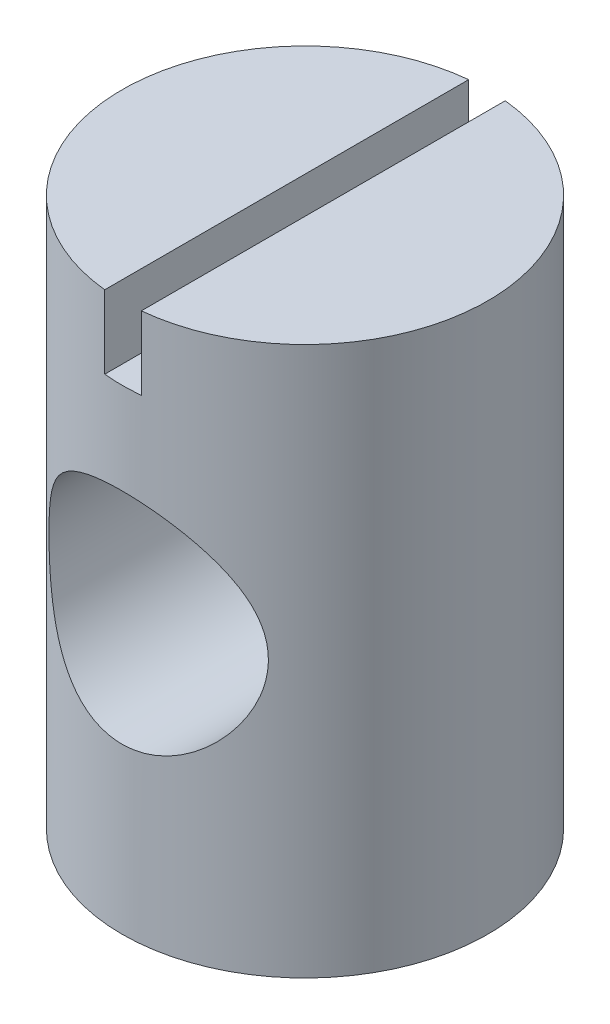
ISO-10303-21;
HEADER;
FILE_DESCRIPTION(('STEP AP214'),'2;1');
FILE_NAME('part.step','',(''),(''),'','','');
FILE_SCHEMA(('AUTOMOTIVE_DESIGN { 1 0 10303 214 1 1 1 1 }'));
ENDSEC;
DATA;
#1=APPLICATION_CONTEXT('core data for automotive mechanical design processes');
#2=APPLICATION_PROTOCOL_DEFINITION('international standard','automotive_design',2000,#1);
#3=PRODUCT_CONTEXT('',#1,'mechanical');
#4=PRODUCT('Part','Part','',(#3));
#5=PRODUCT_RELATED_PRODUCT_CATEGORY('part','',(#4));
#6=PRODUCT_DEFINITION_FORMATION('','',#4);
#7=PRODUCT_DEFINITION_CONTEXT('part definition',#1,'design');
#8=PRODUCT_DEFINITION('design','',#6,#7);
#9=PRODUCT_DEFINITION_SHAPE('','',#8);
#10=(LENGTH_UNIT() NAMED_UNIT(*) SI_UNIT(.MILLI.,.METRE.));
#11=(NAMED_UNIT(*) PLANE_ANGLE_UNIT() SI_UNIT($,.RADIAN.));
#12=(NAMED_UNIT(*) SI_UNIT($,.STERADIAN.) SOLID_ANGLE_UNIT());
#13=UNCERTAINTY_MEASURE_WITH_UNIT(LENGTH_MEASURE(1.E-05),#10,'distance_accuracy_value','');
#14=(GEOMETRIC_REPRESENTATION_CONTEXT(3) GLOBAL_UNCERTAINTY_ASSIGNED_CONTEXT((#13)) GLOBAL_UNIT_ASSIGNED_CONTEXT((#10,
#11,#12)) REPRESENTATION_CONTEXT('',''));
#15=CARTESIAN_POINT('',(0.,0.,0.));
#16=DIRECTION('',(0.,0.,1.));
#17=DIRECTION('',(1.,0.,0.));
#18=AXIS2_PLACEMENT_3D('',#15,#16,#17);
#19=CARTESIAN_POINT('',(0.,15.,0.));
#20=DIRECTION('',(0.,-1.,0.));
#21=DIRECTION('',(0.,0.,-1.));
#22=AXIS2_PLACEMENT_3D('',#19,#20,#21);
#23=CYLINDRICAL_SURFACE('',#22,5.);
#24=CARTESIAN_POINT('',(0.,15.,0.));
#25=DIRECTION('',(0.,1.,0.));
#26=DIRECTION('',(0.,0.,1.));
#27=AXIS2_PLACEMENT_3D('',#24,#25,#26);
#28=CIRCLE('',#27,5.);
#29=CARTESIAN_POINT('',(-0.500000000000001,15.,-4.9749371855331));
#30=VERTEX_POINT('',#29);
#31=CARTESIAN_POINT('',(-0.499999999999999,15.,4.9749371855331));
#32=VERTEX_POINT('',#31);
#33=EDGE_CURVE('E98',#30,#32,#28,.T.);
#34=ORIENTED_EDGE('',*,*,#33,.F.);
#35=DIRECTION('',(0.,-1.,0.));
#36=VECTOR('',#35,1.);
#37=CARTESIAN_POINT('',(-0.500000000000001,15.,-4.9749371855331));
#38=LINE('',#37,#36);
#39=CARTESIAN_POINT('',(-0.500000000000001,13.,-4.9749371855331));
#40=VERTEX_POINT('',#39);
#41=EDGE_CURVE('E104',#30,#40,#38,.T.);
#42=ORIENTED_EDGE('',*,*,#41,.T.);
#43=CARTESIAN_POINT('',(0.,13.,0.));
#44=DIRECTION('',(0.,1.,0.));
#45=DIRECTION('',(0.,0.,1.));
#46=AXIS2_PLACEMENT_3D('',#43,#44,#45);
#47=CIRCLE('',#46,5.);
#48=CARTESIAN_POINT('',(0.499999999999999,13.,-4.9749371855331));
#49=VERTEX_POINT('',#48);
#50=EDGE_CURVE('E94',#49,#40,#47,.T.);
#51=ORIENTED_EDGE('',*,*,#50,.F.);
#52=DIRECTION('',(0.,-1.,0.));
#53=VECTOR('',#52,1.);
#54=CARTESIAN_POINT('',(0.499999999999999,15.,-4.9749371855331));
#55=LINE('',#54,#53);
#56=CARTESIAN_POINT('',(0.499999999999999,15.,-4.9749371855331));
#57=VERTEX_POINT('',#56);
#58=EDGE_CURVE('E82',#49,#57,#55,.F.);
#59=ORIENTED_EDGE('',*,*,#58,.T.);
#60=CARTESIAN_POINT('',(0.500000000000001,15.,4.9749371855331));
#61=VERTEX_POINT('',#60);
#62=EDGE_CURVE('E88',#61,#57,#28,.T.);
#63=ORIENTED_EDGE('',*,*,#62,.F.);
#64=DIRECTION('',(0.,-1.,0.));
#65=VECTOR('',#64,1.);
#66=CARTESIAN_POINT('',(0.500000000000001,15.,4.9749371855331));
#67=LINE('',#66,#65);
#68=CARTESIAN_POINT('',(0.500000000000001,13.,4.9749371855331));
#69=VERTEX_POINT('',#68);
#70=EDGE_CURVE('E53',#61,#69,#67,.T.);
#71=ORIENTED_EDGE('',*,*,#70,.T.);
#72=CARTESIAN_POINT('',(-0.499999999999999,13.,4.9749371855331));
#73=VERTEX_POINT('',#72);
#74=EDGE_CURVE('E109',#73,#69,#47,.T.);
#75=ORIENTED_EDGE('',*,*,#74,.F.);
#76=DIRECTION('',(0.,-1.,0.));
#77=VECTOR('',#76,1.);
#78=CARTESIAN_POINT('',(-0.499999999999999,15.,4.9749371855331));
#79=LINE('',#78,#77);
#80=EDGE_CURVE('E61',#73,#32,#79,.F.);
#81=ORIENTED_EDGE('',*,*,#80,.T.);
#82=EDGE_LOOP('',(#34,#42,#51,#59,#63,#71,#75,#81));
#83=FACE_BOUND('',#82,.T.);
#84=CARTESIAN_POINT('',(0.,0.,0.));
#85=DIRECTION('',(0.,1.,0.));
#86=DIRECTION('',(0.,0.,1.));
#87=AXIS2_PLACEMENT_3D('',#84,#85,#86);
#88=CIRCLE('',#87,5.);
#89=CARTESIAN_POINT('',(0.,0.,5.));
#90=VERTEX_POINT('',#89);
#91=EDGE_CURVE('E101',#90,#90,#88,.T.);
#92=ORIENTED_EDGE('',*,*,#91,.T.);
#93=EDGE_LOOP('',(#92));
#94=FACE_BOUND('',#93,.T.);
#95=CARTESIAN_POINT('',(0.,10.5,-5.));
#96=CARTESIAN_POINT('',(0.0767697294351705,10.4999989437555,-4.99999907546385));
#97=CARTESIAN_POINT('',(0.153562134518387,10.4970464064299,-4.99822567812271));
#98=CARTESIAN_POINT('',(0.306548487758715,10.4852857670203,-4.99118362570631));
#99=CARTESIAN_POINT('',(0.382742059346593,10.4764742388118,-4.98591292553957));
#100=CARTESIAN_POINT('',(0.609808130024627,10.4413514405369,-4.96499345352549));
#101=CARTESIAN_POINT('',(0.758981863291667,10.4063522975666,-4.94423772571335));
#102=CARTESIAN_POINT('',(1.04754167363585,10.3152272564959,-4.89123238995897));
#103=CARTESIAN_POINT('',(1.18697226741342,10.2592060779873,-4.8590397955111));
#104=CARTESIAN_POINT('',(1.45405042800218,10.128279339403,-4.7859070225578));
#105=CARTESIAN_POINT('',(1.58170090938261,10.0533784676398,-4.74496901614699));
#106=CARTESIAN_POINT('',(1.83260160381823,9.88045034488488,-4.65410731283371));
#107=CARTESIAN_POINT('',(1.95476885986166,9.78109260883346,-4.60373587041895));
#108=CARTESIAN_POINT('',(2.1817645874806,9.56506559280781,-4.50060875905921));
#109=CARTESIAN_POINT('',(2.28657046750403,9.44837412578165,-4.4478500955754));
#110=CARTESIAN_POINT('',(2.48890019509837,9.18415297883109,-4.33822134833335));
#111=CARTESIAN_POINT('',(2.5839553962784,9.03459645787782,-4.28164035635797));
#112=CARTESIAN_POINT('',(2.74722868670786,8.71830685367312,-4.17876602596121));
#113=CARTESIAN_POINT('',(2.8154903315581,8.55160220796684,-4.13245604474886));
#114=CARTESIAN_POINT('',(2.90881204577224,8.2468070983431,-4.06709259377223));
#115=CARTESIAN_POINT('',(2.94032394587637,8.11152800163861,-4.04415766338645));
#116=CARTESIAN_POINT('',(2.98432344587083,7.83639256947861,-4.01180616527621));
#117=CARTESIAN_POINT('',(2.99683469884359,7.69654214669596,-4.00237279089368));
#118=CARTESIAN_POINT('',(3.0021101681982,7.41597700735214,-3.99841845126251));
#119=CARTESIAN_POINT('',(2.99483563630785,7.27526113408813,-4.00392674756739));
#120=CARTESIAN_POINT('',(2.96092124146105,6.99744246488214,-4.02906522155629));
#121=CARTESIAN_POINT('',(2.93426681225442,6.86034246705851,-4.04870602134773));
#122=CARTESIAN_POINT('',(2.86347831933193,6.59493945774946,-4.09906376582929));
#123=CARTESIAN_POINT('',(2.8195745342289,6.46654567700555,-4.12963433300037));
#124=CARTESIAN_POINT('',(2.71590167467071,6.2186102333682,-4.19854092703026));
#125=CARTESIAN_POINT('',(2.6561267841416,6.09907183617098,-4.2368797994146));
#126=CARTESIAN_POINT('',(2.51035773820671,5.85003086234366,-4.32510698365561));
#127=CARTESIAN_POINT('',(2.42160671901868,5.72244000763227,-4.3758426358075));
#128=CARTESIAN_POINT('',(2.22582963207776,5.48265084277988,-4.4786102252415));
#129=CARTESIAN_POINT('',(2.11878609335504,5.37046743459787,-4.53064336077653));
#130=CARTESIAN_POINT('',(1.87159040921357,5.14875774055151,-4.63871766962913));
#131=CARTESIAN_POINT('',(1.72890315178769,5.04178060876265,-4.69430681953073));
#132=CARTESIAN_POINT('',(1.50061053630278,4.90073128727714,-4.77018325995047));
#133=CARTESIAN_POINT('',(1.42209821815681,4.8569358644839,-4.79423315237467));
#134=CARTESIAN_POINT('',(1.26074368673913,4.776281176389,-4.83916496756429));
#135=CARTESIAN_POINT('',(1.17790417501176,4.73941764797919,-4.86004883588963));
#136=CARTESIAN_POINT('',(1.01376371174001,4.67518855714336,-4.8968267274493));
#137=CARTESIAN_POINT('',(0.932690066663957,4.64737343955079,-4.91295100454953));
#138=CARTESIAN_POINT('',(0.767879949732826,4.59866604415477,-4.94139126794745));
#139=CARTESIAN_POINT('',(0.684144997174637,4.57776989155364,-4.95370938553284));
#140=CARTESIAN_POINT('',(0.514744462654424,4.54322814527524,-4.97416370514887));
#141=CARTESIAN_POINT('',(0.42908034196961,4.52957724417139,-4.98230296820872));
#142=CARTESIAN_POINT('',(0.256621746592207,4.5097338156098,-4.99415996414414));
#143=CARTESIAN_POINT('',(0.169827432617759,4.50354023914868,-4.99787831889699));
#144=CARTESIAN_POINT('',(-0.0673242571106429,4.49700732971637,-5.00179157954795));
#145=CARTESIAN_POINT('',(-0.218056842610661,4.5041884543694,-4.99746512571837));
#146=CARTESIAN_POINT('',(-0.515686907628997,4.5408455417291,-4.97557955020067));
#147=CARTESIAN_POINT('',(-0.662584464852966,4.57032105234186,-4.95802069684413));
#148=CARTESIAN_POINT('',(-0.945142599254813,4.64908845918428,-4.91189447655688));
#149=CARTESIAN_POINT('',(-1.08098954856944,4.69788112659201,-4.88360514429733));
#150=CARTESIAN_POINT('',(-1.34253345184752,4.81335432420091,-4.81827798628348));
#151=CARTESIAN_POINT('',(-1.46822839746276,4.88003838259407,-4.78123843515362));
#152=CARTESIAN_POINT('',(-1.7200119213015,5.03711409097797,-4.69690981059277));
#153=CARTESIAN_POINT('',(-1.84478813824221,5.12924769383748,-4.6489560240695));
#154=CARTESIAN_POINT('',(-2.07805222548222,5.33078275125476,-4.54948534225871));
#155=CARTESIAN_POINT('',(-2.18652085154156,5.44020429960271,-4.49796434043363));
#156=CARTESIAN_POINT('',(-2.39863988264158,5.68982079149316,-4.38890846835682));
#157=CARTESIAN_POINT('',(-2.49982037884172,5.83216777394304,-4.33146483230154));
#158=CARTESIAN_POINT('',(-2.67690479207535,6.13443204612756,-4.22432364395571));
#159=CARTESIAN_POINT('',(-2.75283533845462,6.29433058715125,-4.1746179606141));
#160=CARTESIAN_POINT('',(-2.86285157351706,6.59248604511072,-4.09969818429266));
#161=CARTESIAN_POINT('',(-2.90243250662613,6.72796062464204,-4.07151318633887));
#162=CARTESIAN_POINT('',(-2.96227327821697,7.00506415623523,-4.02819211510624));
#163=CARTESIAN_POINT('',(-2.98255990395067,7.14668428945152,-4.01303795327895));
#164=CARTESIAN_POINT('',(-3.00268261034206,7.43275389439522,-3.99800893189922));
#165=CARTESIAN_POINT('',(-3.00244179030845,7.5772119782483,-3.99819152744816));
#166=CARTESIAN_POINT('',(-2.98132945103105,7.8637888743464,-4.01395435932838));
#167=CARTESIAN_POINT('',(-2.96044671369591,8.00590637187481,-4.02954296823692));
#168=CARTESIAN_POINT('',(-2.90080351212233,8.2769768239951,-4.07266369966216));
#169=CARTESIAN_POINT('',(-2.86295284328648,8.40623414792436,-4.09958421715569));
#170=CARTESIAN_POINT('',(-2.77126473512031,8.65667454965315,-4.16211005816609));
#171=CARTESIAN_POINT('',(-2.7174212751772,8.77785456561299,-4.19771865147484));
#172=CARTESIAN_POINT('',(-2.58578536859698,9.02863953945999,-4.28025972950371));
#173=CARTESIAN_POINT('',(-2.50558518231556,9.15668150821477,-4.32809142579694));
#174=CARTESIAN_POINT('',(-2.32751213746957,9.3987608453066,-4.42640286674054));
#175=CARTESIAN_POINT('',(-2.22962472612067,9.51278655047955,-4.47688476749087));
#176=CARTESIAN_POINT('',(-2.00020353552556,9.74269884332947,-4.5845123827036));
#177=CARTESIAN_POINT('',(-1.86578571790514,9.85584987986161,-4.64140045738634));
#178=CARTESIAN_POINT('',(-1.57689277813436,10.0582079860481,-4.74731429537958));
#179=CARTESIAN_POINT('',(-1.42241049573675,10.1474064729197,-4.79633723789531));
#180=CARTESIAN_POINT('',(-1.18102189661685,10.2591244741905,-4.85920558314903));
#181=CARTESIAN_POINT('',(-1.10025014285135,10.2923359959645,-4.87817139185349));
#182=CARTESIAN_POINT('',(-0.935442217988385,10.3517721381435,-4.91243413775203));
#183=CARTESIAN_POINT('',(-0.851407984788098,10.3780008357009,-4.9277332153652));
#184=CARTESIAN_POINT('',(-0.681001816074563,10.4230094420757,-4.95415527987996));
#185=CARTESIAN_POINT('',(-0.59463750060929,10.4418110773033,-4.9652904423195));
#186=CARTESIAN_POINT('',(-0.42018374602076,10.471744355323,-4.98308318645253));
#187=CARTESIAN_POINT('',(-0.332095806784394,10.4828823861533,-4.98974449723791));
#188=CARTESIAN_POINT('',(-0.203123929661335,10.4933916838053,-4.99603728421477));
#189=CARTESIAN_POINT('',(-0.162556281113486,10.495868430454,-4.99752198179196));
#190=CARTESIAN_POINT('',(-0.0813278781867663,10.4991728969139,-4.99950360169341));
#191=CARTESIAN_POINT('',(-0.0406671206271711,10.5000005595229,-5.00000048975323));
#192=CARTESIAN_POINT('',(0.,10.5,-5.));
#193=B_SPLINE_CURVE_WITH_KNOTS('',3,(#95,#96,#97,#98,#99,#100,#101,#102,#103,#104,#105,#106,
#107,#108,#109,#110,#111,#112,#113,#114,#115,#116,#117,#118,#119,#120,#121,#122,#123,#124,#125,
#126,#127,#128,#129,#130,#131,#132,#133,#134,#135,#136,#137,#138,#139,#140,#141,#142,#143,#144,
#145,#146,#147,#148,#149,#150,#151,#152,#153,#154,#155,#156,#157,#158,#159,#160,#161,#162,#163,
#164,#165,#166,#167,#168,#169,#170,#171,#172,#173,#174,#175,#176,#177,#178,#179,#180,#181,#182,
#183,#184,#185,#186,#187,#188,#189,#190,#191,#192),.UNSPECIFIED.,.T.,.F.,(4,2,2,2,2,2,2,2,2,2,2,
2,2,2,2,2,2,2,2,2,2,2,2,2,2,2,2,2,2,2,2,2,2,2,2,2,2,2,2,2,2,2,2,2,2,2,2,2,4),(0.,
0.230263300595003,0.4606613693334,0.922002149276126,1.38107466343613,1.84003329022065,
2.33408870888555,2.82878205293211,3.38413315803225,3.93857770807794,4.35913349134877,
4.77916531256766,5.20002031165062,5.62119195971355,6.03692224610024,6.45280509043347,
6.94139679873935,7.43045779030958,7.98767605192992,8.26653157143431,8.54521503013734,
8.80648473589063,9.06760787545943,9.3285394673096,9.58943435026958,10.0398406663534,
10.490237849174,10.9296843257003,11.3692175250854,11.8543559282721,12.3400624135416,
12.889063860465,13.437484464234,13.8674843581987,14.2968863865712,14.7278971274535,
15.1591422350194,15.5696105785277,15.9802336423656,16.4539008129506,16.927959499309,
17.4794148474152,18.0310675325446,18.2988384573895,18.5664526907294,18.8332781687618,
19.0998809626714,19.221853785686,19.3438308395353),.UNSPECIFIED.);
#194=CARTESIAN_POINT('',(0.,10.5,-5.));
#195=VERTEX_POINT('',#194);
#196=EDGE_CURVE('E46',#195,#195,#193,.T.);
#197=ORIENTED_EDGE('',*,*,#196,.F.);
#198=EDGE_LOOP('',(#197));
#199=FACE_BOUND('',#198,.T.);
#200=CARTESIAN_POINT('',(0.,4.5,5.));
#201=CARTESIAN_POINT('',(0.0767697294351705,4.50000105624454,4.99999907546385));
#202=CARTESIAN_POINT('',(0.153562134518387,4.50295359357007,4.99822567812271));
#203=CARTESIAN_POINT('',(0.306548487758715,4.51471423297974,4.99118362570631));
#204=CARTESIAN_POINT('',(0.382742059346592,4.52352576118823,4.98591292553957));
#205=CARTESIAN_POINT('',(0.609808130024627,4.55864855946313,4.96499345352549));
#206=CARTESIAN_POINT('',(0.758981863291667,4.59364770243344,4.94423772571335));
#207=CARTESIAN_POINT('',(1.04754167363585,4.68477274350412,4.89123238995897));
#208=CARTESIAN_POINT('',(1.18697226741342,4.74079392201274,4.8590397955111));
#209=CARTESIAN_POINT('',(1.45405042800218,4.87172066059704,4.7859070225578));
#210=CARTESIAN_POINT('',(1.58170090938261,4.94662153236016,4.74496901614699));
#211=CARTESIAN_POINT('',(1.83260160381823,5.11954965511512,4.65410731283371));
#212=CARTESIAN_POINT('',(1.95476885986166,5.21890739116654,4.60373587041895));
#213=CARTESIAN_POINT('',(2.1817645874806,5.43493440719218,4.50060875905921));
#214=CARTESIAN_POINT('',(2.28657046750404,5.55162587421835,4.4478500955754));
#215=CARTESIAN_POINT('',(2.48890019509838,5.81584702116891,4.33822134833335));
#216=CARTESIAN_POINT('',(2.5839553962784,5.96540354212218,4.28164035635797));
#217=CARTESIAN_POINT('',(2.74722868670786,6.28169314632688,4.17876602596121));
#218=CARTESIAN_POINT('',(2.8154903315581,6.44839779203316,4.13245604474886));
#219=CARTESIAN_POINT('',(2.90881204577224,6.7531929016569,4.06709259377223));
#220=CARTESIAN_POINT('',(2.94032394587637,6.88847199836139,4.04415766338645));
#221=CARTESIAN_POINT('',(2.98432344587083,7.16360743052139,4.01180616527621));
#222=CARTESIAN_POINT('',(2.99683469884359,7.30345785330403,4.00237279089368));
#223=CARTESIAN_POINT('',(3.0021101681982,7.58402299264786,3.99841845126251));
#224=CARTESIAN_POINT('',(2.99483563630785,7.72473886591187,4.00392674756739));
#225=CARTESIAN_POINT('',(2.96092124146105,8.00255753511786,4.02906522155629));
#226=CARTESIAN_POINT('',(2.93426681225442,8.13965753294149,4.04870602134773));
#227=CARTESIAN_POINT('',(2.86347831933193,8.40506054225054,4.09906376582928));
#228=CARTESIAN_POINT('',(2.8195745342289,8.53345432299445,4.12963433300037));
#229=CARTESIAN_POINT('',(2.71590167467071,8.7813897666318,4.19854092703026));
#230=CARTESIAN_POINT('',(2.6561267841416,8.90092816382902,4.23687979941459));
#231=CARTESIAN_POINT('',(2.51035773820671,9.14996913765634,4.32510698365561));
#232=CARTESIAN_POINT('',(2.42160671901868,9.27755999236773,4.3758426358075));
#233=CARTESIAN_POINT('',(2.22582963207776,9.51734915722011,4.4786102252415));
#234=CARTESIAN_POINT('',(2.11878609335504,9.62953256540212,4.53064336077653));
#235=CARTESIAN_POINT('',(1.87159040921357,9.85124225944849,4.63871766962913));
#236=CARTESIAN_POINT('',(1.72890315178769,9.95821939123735,4.69430681953073));
#237=CARTESIAN_POINT('',(1.50061053630278,10.0992687127229,4.77018325995047));
#238=CARTESIAN_POINT('',(1.42209821815681,10.1430641355161,4.79423315237467));
#239=CARTESIAN_POINT('',(1.26074368673913,10.223718823611,4.83916496756429));
#240=CARTESIAN_POINT('',(1.17790417501176,10.2605823520208,4.86004883588963));
#241=CARTESIAN_POINT('',(1.01376371174001,10.3248114428566,4.8968267274493));
#242=CARTESIAN_POINT('',(0.932690066663961,10.3526265604492,4.91295100454953));
#243=CARTESIAN_POINT('',(0.76787994973283,10.4013339558452,4.94139126794745));
#244=CARTESIAN_POINT('',(0.68414499717464,10.4222301084464,4.95370938553284));
#245=CARTESIAN_POINT('',(0.514744462654426,10.4567718547248,4.97416370514887));
#246=CARTESIAN_POINT('',(0.429080341969612,10.4704227558286,4.98230296820872));
#247=CARTESIAN_POINT('',(0.256621746592208,10.4902661843902,4.99415996414414));
#248=CARTESIAN_POINT('',(0.169827432617761,10.4964597608513,4.99787831889699));
#249=CARTESIAN_POINT('',(-0.0673242571106405,10.5029926702836,5.00179157954795));
#250=CARTESIAN_POINT('',(-0.218056842610659,10.4958115456306,4.99746512571837));
#251=CARTESIAN_POINT('',(-0.515686907628994,10.4591544582709,4.97557955020067));
#252=CARTESIAN_POINT('',(-0.662584464852964,10.4296789476581,4.95802069684413));
#253=CARTESIAN_POINT('',(-0.945142599254811,10.3509115408157,4.91189447655688));
#254=CARTESIAN_POINT('',(-1.08098954856944,10.302118873408,4.88360514429733));
#255=CARTESIAN_POINT('',(-1.34253345184752,10.1866456757991,4.81827798628348));
#256=CARTESIAN_POINT('',(-1.46822839746276,10.1199616174059,4.78123843515362));
#257=CARTESIAN_POINT('',(-1.7200119213015,9.96288590902203,4.69690981059278));
#258=CARTESIAN_POINT('',(-1.84478813824221,9.87075230616252,4.6489560240695));
#259=CARTESIAN_POINT('',(-2.07805222548222,9.66921724874524,4.54948534225871));
#260=CARTESIAN_POINT('',(-2.18652085154156,9.55979570039729,4.49796434043363));
#261=CARTESIAN_POINT('',(-2.39863988264158,9.31017920850685,4.38890846835682));
#262=CARTESIAN_POINT('',(-2.49982037884172,9.16783222605696,4.33146483230154));
#263=CARTESIAN_POINT('',(-2.67690479207535,8.86556795387244,4.22432364395571));
#264=CARTESIAN_POINT('',(-2.75283533845462,8.70566941284875,4.1746179606141));
#265=CARTESIAN_POINT('',(-2.86285157351706,8.40751395488928,4.09969818429266));
#266=CARTESIAN_POINT('',(-2.90243250662613,8.27203937535796,4.07151318633887));
#267=CARTESIAN_POINT('',(-2.96227327821697,7.99493584376477,4.02819211510624));
#268=CARTESIAN_POINT('',(-2.98255990395067,7.85331571054848,4.01303795327895));
#269=CARTESIAN_POINT('',(-3.00268261034206,7.56724610560478,3.99800893189922));
#270=CARTESIAN_POINT('',(-3.00244179030845,7.4227880217517,3.99819152744816));
#271=CARTESIAN_POINT('',(-2.98132945103105,7.1362111256536,4.01395435932838));
#272=CARTESIAN_POINT('',(-2.96044671369591,6.99409362812519,4.02954296823692));
#273=CARTESIAN_POINT('',(-2.90080351212233,6.7230231760049,4.07266369966216));
#274=CARTESIAN_POINT('',(-2.86295284328648,6.59376585207564,4.09958421715569));
#275=CARTESIAN_POINT('',(-2.77126473512031,6.34332545034685,4.16211005816609));
#276=CARTESIAN_POINT('',(-2.7174212751772,6.22214543438701,4.19771865147484));
#277=CARTESIAN_POINT('',(-2.58578536859698,5.97136046054001,4.28025972950371));
#278=CARTESIAN_POINT('',(-2.50558518231556,5.84331849178523,4.32809142579694));
#279=CARTESIAN_POINT('',(-2.32751213746957,5.6012391546934,4.42640286674054));
#280=CARTESIAN_POINT('',(-2.22962472612067,5.48721344952045,4.47688476749087));
#281=CARTESIAN_POINT('',(-2.00020353552556,5.25730115667053,4.5845123827036));
#282=CARTESIAN_POINT('',(-1.86578571790513,5.14415012013839,4.64140045738634));
#283=CARTESIAN_POINT('',(-1.57689277813436,4.94179201395186,4.74731429537958));
#284=CARTESIAN_POINT('',(-1.42241049573675,4.85259352708028,4.79633723789531));
#285=CARTESIAN_POINT('',(-1.18102189661685,4.74087552580947,4.85920558314903));
#286=CARTESIAN_POINT('',(-1.10025014285135,4.70766400403551,4.87817139185349));
#287=CARTESIAN_POINT('',(-0.935442217988386,4.64822786185654,4.91243413775203));
#288=CARTESIAN_POINT('',(-0.851407984788099,4.62199916429907,4.9277332153652));
#289=CARTESIAN_POINT('',(-0.681001816074562,4.57699055792425,4.95415527987996));
#290=CARTESIAN_POINT('',(-0.594637500609288,4.55818892269669,4.9652904423195));
#291=CARTESIAN_POINT('',(-0.420183746020758,4.52825564467701,4.98308318645253));
#292=CARTESIAN_POINT('',(-0.332095806784393,4.51711761384669,4.98974449723791));
#293=CARTESIAN_POINT('',(-0.203123929661335,4.50660831619467,4.99603728421477));
#294=CARTESIAN_POINT('',(-0.162556281113486,4.504131569546,4.99752198179196));
#295=CARTESIAN_POINT('',(-0.0813278781867661,4.50082710308606,4.99950360169341));
#296=CARTESIAN_POINT('',(-0.040667120627171,4.49999944047707,5.00000048975323));
#297=CARTESIAN_POINT('',(0.,4.5,5.));
#298=B_SPLINE_CURVE_WITH_KNOTS('',3,(#200,#201,#202,#203,#204,#205,#206,#207,#208,#209,#210,
#211,#212,#213,#214,#215,#216,#217,#218,#219,#220,#221,#222,#223,#224,#225,#226,#227,#228,#229,
#230,#231,#232,#233,#234,#235,#236,#237,#238,#239,#240,#241,#242,#243,#244,#245,#246,#247,#248,
#249,#250,#251,#252,#253,#254,#255,#256,#257,#258,#259,#260,#261,#262,#263,#264,#265,#266,#267,
#268,#269,#270,#271,#272,#273,#274,#275,#276,#277,#278,#279,#280,#281,#282,#283,#284,#285,#286,
#287,#288,#289,#290,#291,#292,#293,#294,#295,#296,#297),.UNSPECIFIED.,.T.,.F.,(4,2,2,2,2,2,2,2,
2,2,2,2,2,2,2,2,2,2,2,2,2,2,2,2,2,2,2,2,2,2,2,2,2,2,2,2,2,2,2,2,2,2,2,2,2,2,2,2,4),(0.,
0.230263300595002,0.4606613693334,0.922002149276126,1.38107466343613,1.84003329022065,
2.33408870888555,2.82878205293211,3.38413315803225,3.93857770807794,4.35913349134877,
4.77916531256766,5.20002031165062,5.62119195971355,6.03692224610023,6.45280509043347,
6.94139679873935,7.43045779030958,7.98767605192992,8.26653157143431,8.54521503013734,
8.80648473589063,9.06760787545943,9.3285394673096,9.58943435026958,10.0398406663534,
10.490237849174,10.9296843257003,11.3692175250854,11.8543559282721,12.3400624135416,
12.889063860465,13.437484464234,13.8674843581987,14.2968863865712,14.7278971274535,
15.1591422350194,15.5696105785277,15.9802336423656,16.4539008129506,16.927959499309,
17.4794148474152,18.0310675325446,18.2988384573895,18.5664526907294,18.8332781687618,
19.0998809626714,19.221853785686,19.3438308395353),.UNSPECIFIED.);
#299=CARTESIAN_POINT('',(0.,4.5,5.));
#300=VERTEX_POINT('',#299);
#301=EDGE_CURVE('E11',#300,#300,#298,.T.);
#302=ORIENTED_EDGE('',*,*,#301,.F.);
#303=EDGE_LOOP('',(#302));
#304=FACE_BOUND('',#303,.T.);
#305=ADVANCED_FACE('F35',(#83,#94,#199,#304),#23,.T.);
#306=CARTESIAN_POINT('',(0.,15.,0.));
#307=DIRECTION('',(0.,1.,0.));
#308=DIRECTION('',(0.,0.,1.));
#309=AXIS2_PLACEMENT_3D('',#306,#307,#308);
#310=PLANE('',#309);
#311=DIRECTION('',(0.,0.,1.));
#312=VECTOR('',#311,1.);
#313=CARTESIAN_POINT('',(-0.5,15.,0.));
#314=LINE('',#313,#312);
#315=EDGE_CURVE('E87',#30,#32,#314,.T.);
#316=ORIENTED_EDGE('',*,*,#315,.F.);
#317=ORIENTED_EDGE('',*,*,#33,.T.);
#318=EDGE_LOOP('',(#316,#317));
#319=FACE_BOUND('',#318,.T.);
#320=ADVANCED_FACE('F130',(#319),#310,.T.);
#321=DIRECTION('',(0.,0.,-1.));
#322=VECTOR('',#321,1.);
#323=CARTESIAN_POINT('',(0.5,15.,0.));
#324=LINE('',#323,#322);
#325=EDGE_CURVE('E79',#61,#57,#324,.T.);
#326=ORIENTED_EDGE('',*,*,#325,.F.);
#327=ORIENTED_EDGE('',*,*,#62,.T.);
#328=EDGE_LOOP('',(#326,#327));
#329=FACE_BOUND('',#328,.T.);
#330=ADVANCED_FACE('F97',(#329),#310,.T.);
#331=CARTESIAN_POINT('',(0.,0.,0.));
#332=DIRECTION('',(0.,1.,0.));
#333=DIRECTION('',(0.,0.,1.));
#334=AXIS2_PLACEMENT_3D('',#331,#332,#333);
#335=PLANE('',#334);
#336=ORIENTED_EDGE('',*,*,#91,.F.);
#337=EDGE_LOOP('',(#336));
#338=FACE_BOUND('',#337,.T.);
#339=ADVANCED_FACE('F123',(#338),#335,.F.);
#340=CARTESIAN_POINT('',(0.,13.,0.));
#341=DIRECTION('',(0.,1.,0.));
#342=DIRECTION('',(0.,0.,1.));
#343=AXIS2_PLACEMENT_3D('',#340,#341,#342);
#344=PLANE('',#343);
#345=DIRECTION('',(0.,0.,-1.));
#346=VECTOR('',#345,1.);
#347=CARTESIAN_POINT('',(0.499999999999999,13.,-5.));
#348=LINE('',#347,#346);
#349=EDGE_CURVE('E95',#69,#49,#348,.T.);
#350=ORIENTED_EDGE('',*,*,#349,.T.);
#351=ORIENTED_EDGE('',*,*,#50,.T.);
#352=DIRECTION('',(0.,0.,1.));
#353=VECTOR('',#352,1.);
#354=CARTESIAN_POINT('',(-0.500000000000001,13.,-5.));
#355=LINE('',#354,#353);
#356=EDGE_CURVE('E148',#40,#73,#355,.T.);
#357=ORIENTED_EDGE('',*,*,#356,.T.);
#358=ORIENTED_EDGE('',*,*,#74,.T.);
#359=EDGE_LOOP('',(#350,#351,#357,#358));
#360=FACE_BOUND('',#359,.T.);
#361=ADVANCED_FACE('F118',(#360),#344,.T.);
#362=CARTESIAN_POINT('',(-0.500000000000001,13.,-5.));
#363=DIRECTION('',(-1.,0.,0.));
#364=DIRECTION('',(0.,0.,1.));
#365=AXIS2_PLACEMENT_3D('',#362,#363,#364);
#366=PLANE('',#365);
#367=ORIENTED_EDGE('',*,*,#315,.T.);
#368=ORIENTED_EDGE('',*,*,#80,.F.);
#369=ORIENTED_EDGE('',*,*,#356,.F.);
#370=ORIENTED_EDGE('',*,*,#41,.F.);
#371=EDGE_LOOP('',(#367,#368,#369,#370));
#372=FACE_BOUND('',#371,.T.);
#373=ADVANCED_FACE('F122',(#372),#366,.F.);
#374=CARTESIAN_POINT('',(0.499999999999999,13.,-5.));
#375=DIRECTION('',(1.,0.,0.));
#376=DIRECTION('',(0.,0.,-1.));
#377=AXIS2_PLACEMENT_3D('',#374,#375,#376);
#378=PLANE('',#377);
#379=ORIENTED_EDGE('',*,*,#325,.T.);
#380=ORIENTED_EDGE('',*,*,#58,.F.);
#381=ORIENTED_EDGE('',*,*,#349,.F.);
#382=ORIENTED_EDGE('',*,*,#70,.F.);
#383=EDGE_LOOP('',(#379,#380,#381,#382));
#384=FACE_BOUND('',#383,.T.);
#385=ADVANCED_FACE('F81',(#384),#378,.F.);
#386=CARTESIAN_POINT('',(0.,7.5,5.));
#387=DIRECTION('',(0.,0.,-1.));
#388=DIRECTION('',(-1.,0.,0.));
#389=AXIS2_PLACEMENT_3D('',#386,#387,#388);
#390=CYLINDRICAL_SURFACE('',#389,3.);
#391=ORIENTED_EDGE('',*,*,#301,.T.);
#392=EDGE_LOOP('',(#391));
#393=FACE_BOUND('',#392,.T.);
#394=ORIENTED_EDGE('',*,*,#196,.T.);
#395=EDGE_LOOP('',(#394));
#396=FACE_BOUND('',#395,.T.);
#397=ADVANCED_FACE('F113',(#393,#396),#390,.F.);
#398=CLOSED_SHELL('',(#305,#320,#330,#339,#361,#373,#385,#397));
#399=MANIFOLD_SOLID_BREP('B2',#398);
#400=ADVANCED_BREP_SHAPE_REPRESENTATION('',(#18,#399),#14);
#401=SHAPE_DEFINITION_REPRESENTATION(#9,#400);
ENDSEC;
END-ISO-10303-21;
